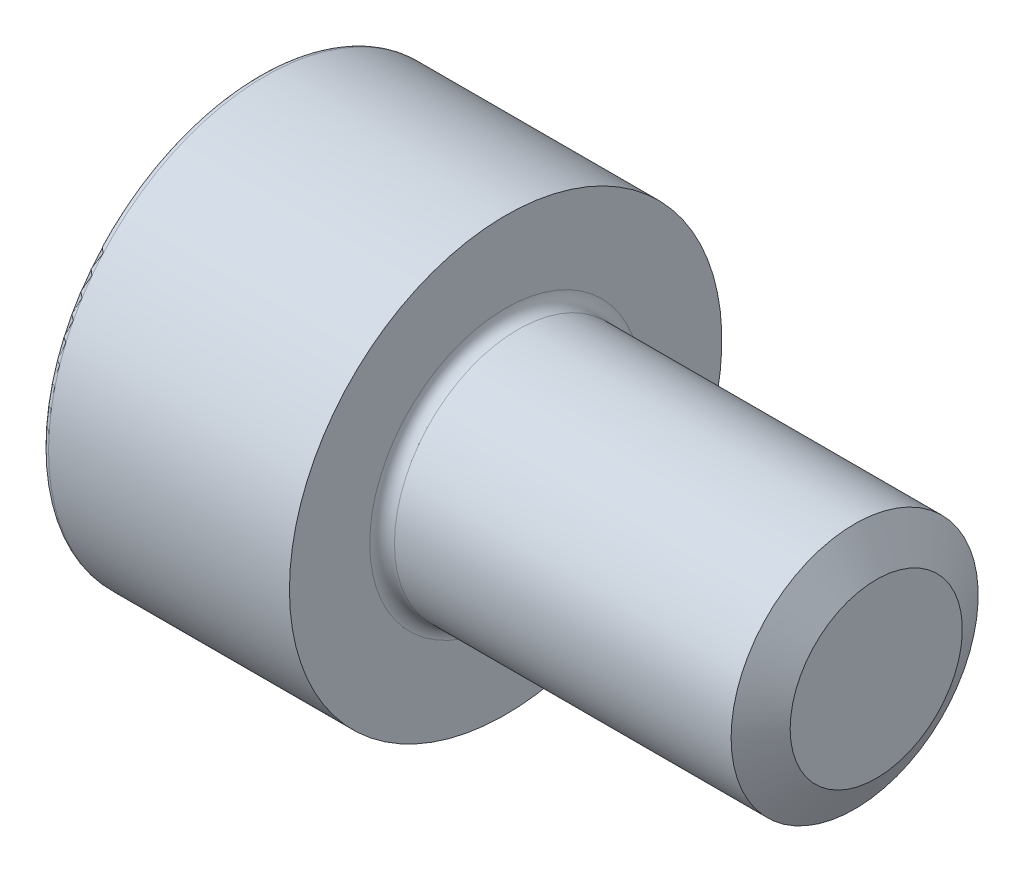
ISO-10303-21;
HEADER;
FILE_DESCRIPTION(('STEP AP214'),'2;1');
FILE_NAME('part.step','',(''),(''),'','','');
FILE_SCHEMA(('AUTOMOTIVE_DESIGN { 1 0 10303 214 1 1 1 1 }'));
ENDSEC;
DATA;
#1=APPLICATION_CONTEXT('core data for automotive mechanical design processes');
#2=APPLICATION_PROTOCOL_DEFINITION('international standard','automotive_design',2000,#1);
#3=PRODUCT_CONTEXT('',#1,'mechanical');
#4=PRODUCT('Part','Part','',(#3));
#5=PRODUCT_RELATED_PRODUCT_CATEGORY('part','',(#4));
#6=PRODUCT_DEFINITION_FORMATION('','',#4);
#7=PRODUCT_DEFINITION_CONTEXT('part definition',#1,'design');
#8=PRODUCT_DEFINITION('design','',#6,#7);
#9=PRODUCT_DEFINITION_SHAPE('','',#8);
#10=(LENGTH_UNIT() NAMED_UNIT(*) SI_UNIT(.MILLI.,.METRE.));
#11=(NAMED_UNIT(*) PLANE_ANGLE_UNIT() SI_UNIT($,.RADIAN.));
#12=(NAMED_UNIT(*) SI_UNIT($,.STERADIAN.) SOLID_ANGLE_UNIT());
#13=UNCERTAINTY_MEASURE_WITH_UNIT(LENGTH_MEASURE(1.E-05),#10,'distance_accuracy_value','');
#14=(GEOMETRIC_REPRESENTATION_CONTEXT(3) GLOBAL_UNCERTAINTY_ASSIGNED_CONTEXT((#13)) GLOBAL_UNIT_ASSIGNED_CONTEXT((#10,
#11,#12)) REPRESENTATION_CONTEXT('',''));
#15=CARTESIAN_POINT('',(0.,0.,0.));
#16=DIRECTION('',(0.,0.,1.));
#17=DIRECTION('',(1.,0.,0.));
#18=AXIS2_PLACEMENT_3D('',#15,#16,#17);
#19=CARTESIAN_POINT('',(0.,0.,0.));
#20=DIRECTION('',(-1.,0.,0.));
#21=DIRECTION('',(0.,0.,1.));
#22=AXIS2_PLACEMENT_3D('',#19,#20,#21);
#23=CYLINDRICAL_SURFACE('',#22,2.);
#24=CARTESIAN_POINT('',(4.2,0.,0.));
#25=DIRECTION('',(-1.,0.,0.));
#26=DIRECTION('',(0.,0.,1.));
#27=AXIS2_PLACEMENT_3D('',#24,#25,#26);
#28=CIRCLE('',#27,2.);
#29=CARTESIAN_POINT('',(4.2,0.,2.));
#30=VERTEX_POINT('',#29);
#31=EDGE_CURVE('E140',#30,#30,#28,.T.);
#32=ORIENTED_EDGE('',*,*,#31,.F.);
#33=EDGE_LOOP('',(#32));
#34=FACE_BOUND('',#33,.T.);
#35=CARTESIAN_POINT('',(9.65001026681725,0.,0.));
#36=DIRECTION('',(-1.,0.,0.));
#37=DIRECTION('',(0.,0.,1.));
#38=AXIS2_PLACEMENT_3D('',#35,#36,#37);
#39=CIRCLE('',#38,2.);
#40=CARTESIAN_POINT('',(9.65001026681725,0.,2.));
#41=VERTEX_POINT('',#40);
#42=EDGE_CURVE('E310',#41,#41,#39,.T.);
#43=ORIENTED_EDGE('',*,*,#42,.T.);
#44=EDGE_LOOP('',(#43));
#45=FACE_BOUND('',#44,.T.);
#46=ADVANCED_FACE('F37',(#34,#45),#23,.T.);
#47=CARTESIAN_POINT('',(0.,0.,0.));
#48=DIRECTION('',(1.,0.,0.));
#49=DIRECTION('',(0.,0.,-1.));
#50=AXIS2_PLACEMENT_3D('',#47,#48,#49);
#51=PLANE('',#50);
#52=CARTESIAN_POINT('',(0.,0.,0.));
#53=DIRECTION('',(1.,0.,0.));
#54=DIRECTION('',(0.,0.,-1.));
#55=AXIS2_PLACEMENT_3D('',#52,#53,#54);
#56=CIRCLE('',#55,3.4);
#57=CARTESIAN_POINT('',(0.,0.,-3.4));
#58=VERTEX_POINT('',#57);
#59=EDGE_CURVE('E45',#58,#58,#56,.F.);
#60=ORIENTED_EDGE('',*,*,#59,.T.);
#61=EDGE_LOOP('',(#60));
#62=FACE_BOUND('',#61,.T.);
#63=DIRECTION('',(0.,0.866025403784438,-0.5));
#64=VECTOR('',#63,1.);
#65=CARTESIAN_POINT('',(0.,0.,1.72));
#66=LINE('',#65,#64);
#67=CARTESIAN_POINT('',(0.,0.,1.72));
#68=VERTEX_POINT('',#67);
#69=CARTESIAN_POINT('',(0.,1.48956369450923,0.859999999999999));
#70=VERTEX_POINT('',#69);
#71=EDGE_CURVE('E126',#68,#70,#66,.T.);
#72=ORIENTED_EDGE('',*,*,#71,.F.);
#73=DIRECTION('',(0.,0.866025403784439,0.5));
#74=VECTOR('',#73,1.);
#75=CARTESIAN_POINT('',(0.,-1.48956369450923,0.86));
#76=LINE('',#75,#74);
#77=CARTESIAN_POINT('',(0.,-1.48956369450923,0.86));
#78=VERTEX_POINT('',#77);
#79=EDGE_CURVE('E52',#78,#68,#76,.T.);
#80=ORIENTED_EDGE('',*,*,#79,.F.);
#81=DIRECTION('',(0.,0.,1.));
#82=VECTOR('',#81,1.);
#83=CARTESIAN_POINT('',(0.,-1.48956369450923,-0.86));
#84=LINE('',#83,#82);
#85=CARTESIAN_POINT('',(0.,-1.48956369450923,-0.86));
#86=VERTEX_POINT('',#85);
#87=EDGE_CURVE('E136',#86,#78,#84,.T.);
#88=ORIENTED_EDGE('',*,*,#87,.F.);
#89=DIRECTION('',(0.,-0.866025403784438,0.5));
#90=VECTOR('',#89,1.);
#91=CARTESIAN_POINT('',(0.,0.,-1.72));
#92=LINE('',#91,#90);
#93=CARTESIAN_POINT('',(0.,0.,-1.72));
#94=VERTEX_POINT('',#93);
#95=EDGE_CURVE('E134',#94,#86,#92,.T.);
#96=ORIENTED_EDGE('',*,*,#95,.F.);
#97=DIRECTION('',(0.,-0.866025403784439,-0.5));
#98=VECTOR('',#97,1.);
#99=CARTESIAN_POINT('',(0.,1.48956369450923,-0.86));
#100=LINE('',#99,#98);
#101=CARTESIAN_POINT('',(0.,1.48956369450923,-0.86));
#102=VERTEX_POINT('',#101);
#103=EDGE_CURVE('E100',#102,#94,#100,.T.);
#104=ORIENTED_EDGE('',*,*,#103,.F.);
#105=DIRECTION('',(0.,0.,-1.));
#106=VECTOR('',#105,1.);
#107=CARTESIAN_POINT('',(0.,1.48956369450923,0.859999999999999));
#108=LINE('',#107,#106);
#109=EDGE_CURVE('E130',#70,#102,#108,.T.);
#110=ORIENTED_EDGE('',*,*,#109,.F.);
#111=EDGE_LOOP('',(#72,#80,#88,#96,#104,#110));
#112=FACE_BOUND('',#111,.T.);
#113=ADVANCED_FACE('F156',(#62,#112),#51,.F.);
#114=CARTESIAN_POINT('',(0.,0.,0.));
#115=DIRECTION('',(-1.,0.,0.));
#116=DIRECTION('',(0.,0.,1.));
#117=AXIS2_PLACEMENT_3D('',#114,#115,#116);
#118=CYLINDRICAL_SURFACE('',#117,3.5);
#119=CARTESIAN_POINT('',(0.1,0.,0.));
#120=DIRECTION('',(1.,0.,0.));
#121=DIRECTION('',(0.,0.,-1.));
#122=AXIS2_PLACEMENT_3D('',#119,#120,#121);
#123=CIRCLE('',#122,3.5);
#124=CARTESIAN_POINT('',(0.1,0.,-3.5));
#125=VERTEX_POINT('',#124);
#126=EDGE_CURVE('E11',#125,#125,#123,.T.);
#127=ORIENTED_EDGE('',*,*,#126,.T.);
#128=EDGE_LOOP('',(#127));
#129=FACE_BOUND('',#128,.T.);
#130=CARTESIAN_POINT('',(4.,0.,0.));
#131=DIRECTION('',(-1.,0.,0.));
#132=DIRECTION('',(0.,0.,1.));
#133=AXIS2_PLACEMENT_3D('',#130,#131,#132);
#134=CIRCLE('',#133,3.5);
#135=CARTESIAN_POINT('',(4.,0.,3.5));
#136=VERTEX_POINT('',#135);
#137=EDGE_CURVE('E151',#136,#136,#134,.T.);
#138=ORIENTED_EDGE('',*,*,#137,.T.);
#139=EDGE_LOOP('',(#138));
#140=FACE_BOUND('',#139,.T.);
#141=ADVANCED_FACE('F175',(#129,#140),#118,.T.);
#142=CARTESIAN_POINT('',(4.,3.5,0.));
#143=DIRECTION('',(-1.,0.,0.));
#144=DIRECTION('',(0.,0.,1.));
#145=AXIS2_PLACEMENT_3D('',#142,#143,#144);
#146=PLANE('',#145);
#147=ORIENTED_EDGE('',*,*,#137,.F.);
#148=EDGE_LOOP('',(#147));
#149=FACE_BOUND('',#148,.T.);
#150=CARTESIAN_POINT('',(4.,0.,0.));
#151=DIRECTION('',(-1.,0.,0.));
#152=DIRECTION('',(0.,0.,1.));
#153=AXIS2_PLACEMENT_3D('',#150,#151,#152);
#154=CIRCLE('',#153,2.2);
#155=CARTESIAN_POINT('',(4.,0.,2.2));
#156=VERTEX_POINT('',#155);
#157=EDGE_CURVE('E148',#156,#156,#154,.T.);
#158=ORIENTED_EDGE('',*,*,#157,.T.);
#159=EDGE_LOOP('',(#158));
#160=FACE_BOUND('',#159,.T.);
#161=ADVANCED_FACE('F184',(#149,#160),#146,.F.);
#162=CARTESIAN_POINT('',(4.2,0.,0.));
#163=DIRECTION('',(-1.,0.,0.));
#164=DIRECTION('',(0.,0.,1.));
#165=AXIS2_PLACEMENT_3D('',#162,#163,#164);
#166=TOROIDAL_SURFACE('',#165,2.2,0.2);
#167=ORIENTED_EDGE('',*,*,#157,.F.);
#168=EDGE_LOOP('',(#167));
#169=FACE_BOUND('',#168,.T.);
#170=ORIENTED_EDGE('',*,*,#31,.T.);
#171=EDGE_LOOP('',(#170));
#172=FACE_BOUND('',#171,.T.);
#173=ADVANCED_FACE('F180',(#169,#172),#166,.F.);
#174=CARTESIAN_POINT('',(2.,-1.48956369450923,0.86));
#175=DIRECTION('',(0.,-0.5,0.866025403784439));
#176=DIRECTION('',(0.,-0.866025403784439,-0.5));
#177=AXIS2_PLACEMENT_3D('',#174,#175,#176);
#178=PLANE('',#177);
#179=ORIENTED_EDGE('',*,*,#79,.T.);
#180=DIRECTION('',(-1.,0.,0.));
#181=VECTOR('',#180,1.);
#182=CARTESIAN_POINT('',(2.,0.,1.72));
#183=LINE('',#182,#181);
#184=CARTESIAN_POINT('',(2.,0.,1.72));
#185=VERTEX_POINT('',#184);
#186=EDGE_CURVE('E82',#185,#68,#183,.T.);
#187=ORIENTED_EDGE('',*,*,#186,.F.);
#188=DIRECTION('',(0.,0.866025403784439,0.5));
#189=VECTOR('',#188,1.);
#190=CARTESIAN_POINT('',(2.,-1.48956369450923,0.86));
#191=LINE('',#190,#189);
#192=CARTESIAN_POINT('',(2.,-1.48956369450923,0.86));
#193=VERTEX_POINT('',#192);
#194=EDGE_CURVE('E138',#193,#185,#191,.T.);
#195=ORIENTED_EDGE('',*,*,#194,.F.);
#196=DIRECTION('',(-1.,0.,0.));
#197=VECTOR('',#196,1.);
#198=CARTESIAN_POINT('',(2.,-1.48956369450923,0.86));
#199=LINE('',#198,#197);
#200=EDGE_CURVE('E60',#193,#78,#199,.T.);
#201=ORIENTED_EDGE('',*,*,#200,.T.);
#202=EDGE_LOOP('',(#179,#187,#195,#201));
#203=FACE_BOUND('',#202,.T.);
#204=ADVANCED_FACE('F183',(#203),#178,.F.);
#205=CARTESIAN_POINT('',(2.,-1.48956369450923,-0.86));
#206=DIRECTION('',(0.,-1.,0.));
#207=DIRECTION('',(0.,0.,-1.));
#208=AXIS2_PLACEMENT_3D('',#205,#206,#207);
#209=PLANE('',#208);
#210=ORIENTED_EDGE('',*,*,#87,.T.);
#211=ORIENTED_EDGE('',*,*,#200,.F.);
#212=DIRECTION('',(0.,0.,1.));
#213=VECTOR('',#212,1.);
#214=CARTESIAN_POINT('',(2.,-1.48956369450923,-0.86));
#215=LINE('',#214,#213);
#216=CARTESIAN_POINT('',(2.,-1.48956369450923,-0.86));
#217=VERTEX_POINT('',#216);
#218=EDGE_CURVE('E112',#217,#193,#215,.T.);
#219=ORIENTED_EDGE('',*,*,#218,.F.);
#220=DIRECTION('',(-1.,0.,0.));
#221=VECTOR('',#220,1.);
#222=CARTESIAN_POINT('',(2.,-1.48956369450923,-0.86));
#223=LINE('',#222,#221);
#224=EDGE_CURVE('E104',#217,#86,#223,.T.);
#225=ORIENTED_EDGE('',*,*,#224,.T.);
#226=EDGE_LOOP('',(#210,#211,#219,#225));
#227=FACE_BOUND('',#226,.T.);
#228=ADVANCED_FACE('F214',(#227),#209,.F.);
#229=CARTESIAN_POINT('',(2.,0.,-1.72));
#230=DIRECTION('',(0.,-0.5,-0.866025403784439));
#231=DIRECTION('',(0.,0.866025403784438,-0.5));
#232=AXIS2_PLACEMENT_3D('',#229,#230,#231);
#233=PLANE('',#232);
#234=ORIENTED_EDGE('',*,*,#95,.T.);
#235=ORIENTED_EDGE('',*,*,#224,.F.);
#236=DIRECTION('',(0.,-0.866025403784438,0.5));
#237=VECTOR('',#236,1.);
#238=CARTESIAN_POINT('',(2.,0.,-1.72));
#239=LINE('',#238,#237);
#240=CARTESIAN_POINT('',(2.,0.,-1.72));
#241=VERTEX_POINT('',#240);
#242=EDGE_CURVE('E108',#241,#217,#239,.T.);
#243=ORIENTED_EDGE('',*,*,#242,.F.);
#244=DIRECTION('',(-1.,0.,0.));
#245=VECTOR('',#244,1.);
#246=CARTESIAN_POINT('',(2.,0.,-1.72));
#247=LINE('',#246,#245);
#248=EDGE_CURVE('E93',#241,#94,#247,.T.);
#249=ORIENTED_EDGE('',*,*,#248,.T.);
#250=EDGE_LOOP('',(#234,#235,#243,#249));
#251=FACE_BOUND('',#250,.T.);
#252=ADVANCED_FACE('F109',(#251),#233,.F.);
#253=CARTESIAN_POINT('',(2.,1.48956369450923,-0.86));
#254=DIRECTION('',(0.,0.5,-0.866025403784439));
#255=DIRECTION('',(0.,0.866025403784439,0.5));
#256=AXIS2_PLACEMENT_3D('',#253,#254,#255);
#257=PLANE('',#256);
#258=ORIENTED_EDGE('',*,*,#103,.T.);
#259=ORIENTED_EDGE('',*,*,#248,.F.);
#260=DIRECTION('',(0.,-0.866025403784439,-0.5));
#261=VECTOR('',#260,1.);
#262=CARTESIAN_POINT('',(2.,1.48956369450923,-0.86));
#263=LINE('',#262,#261);
#264=CARTESIAN_POINT('',(2.,1.48956369450923,-0.86));
#265=VERTEX_POINT('',#264);
#266=EDGE_CURVE('E97',#265,#241,#263,.T.);
#267=ORIENTED_EDGE('',*,*,#266,.F.);
#268=DIRECTION('',(-1.,0.,0.));
#269=VECTOR('',#268,1.);
#270=CARTESIAN_POINT('',(2.,1.48956369450923,-0.86));
#271=LINE('',#270,#269);
#272=EDGE_CURVE('E105',#265,#102,#271,.T.);
#273=ORIENTED_EDGE('',*,*,#272,.T.);
#274=EDGE_LOOP('',(#258,#259,#267,#273));
#275=FACE_BOUND('',#274,.T.);
#276=ADVANCED_FACE('F95',(#275),#257,.F.);
#277=CARTESIAN_POINT('',(2.,1.48956369450923,0.859999999999999));
#278=DIRECTION('',(0.,1.,0.));
#279=DIRECTION('',(0.,0.,1.));
#280=AXIS2_PLACEMENT_3D('',#277,#278,#279);
#281=PLANE('',#280);
#282=ORIENTED_EDGE('',*,*,#109,.T.);
#283=ORIENTED_EDGE('',*,*,#272,.F.);
#284=DIRECTION('',(0.,0.,-1.));
#285=VECTOR('',#284,1.);
#286=CARTESIAN_POINT('',(2.,1.48956369450923,0.859999999999999));
#287=LINE('',#286,#285);
#288=CARTESIAN_POINT('',(2.,1.48956369450923,0.859999999999999));
#289=VERTEX_POINT('',#288);
#290=EDGE_CURVE('E118',#289,#265,#287,.T.);
#291=ORIENTED_EDGE('',*,*,#290,.F.);
#292=DIRECTION('',(-1.,0.,0.));
#293=VECTOR('',#292,1.);
#294=CARTESIAN_POINT('',(2.,1.48956369450923,0.859999999999999));
#295=LINE('',#294,#293);
#296=EDGE_CURVE('E143',#289,#70,#295,.T.);
#297=ORIENTED_EDGE('',*,*,#296,.T.);
#298=EDGE_LOOP('',(#282,#283,#291,#297));
#299=FACE_BOUND('',#298,.T.);
#300=ADVANCED_FACE('F232',(#299),#281,.F.);
#301=CARTESIAN_POINT('',(2.,0.,1.72));
#302=DIRECTION('',(0.,0.5,0.866025403784439));
#303=DIRECTION('',(0.,-0.866025403784438,0.5));
#304=AXIS2_PLACEMENT_3D('',#301,#302,#303);
#305=PLANE('',#304);
#306=ORIENTED_EDGE('',*,*,#71,.T.);
#307=ORIENTED_EDGE('',*,*,#296,.F.);
#308=DIRECTION('',(0.,0.866025403784438,-0.5));
#309=VECTOR('',#308,1.);
#310=CARTESIAN_POINT('',(2.,0.,1.72));
#311=LINE('',#310,#309);
#312=EDGE_CURVE('E120',#185,#289,#311,.T.);
#313=ORIENTED_EDGE('',*,*,#312,.F.);
#314=ORIENTED_EDGE('',*,*,#186,.T.);
#315=EDGE_LOOP('',(#306,#307,#313,#314));
#316=FACE_BOUND('',#315,.T.);
#317=ADVANCED_FACE('F239',(#316),#305,.F.);
#318=CARTESIAN_POINT('',(2.,1.48956369450923,2.58));
#319=DIRECTION('',(-1.,0.,0.));
#320=DIRECTION('',(0.,0.,1.));
#321=AXIS2_PLACEMENT_3D('',#318,#319,#320);
#322=PLANE('',#321);
#323=ORIENTED_EDGE('',*,*,#194,.T.);
#324=ORIENTED_EDGE('',*,*,#312,.T.);
#325=ORIENTED_EDGE('',*,*,#290,.T.);
#326=ORIENTED_EDGE('',*,*,#266,.T.);
#327=ORIENTED_EDGE('',*,*,#242,.T.);
#328=ORIENTED_EDGE('',*,*,#218,.T.);
#329=EDGE_LOOP('',(#323,#324,#325,#326,#327,#328));
#330=FACE_BOUND('',#329,.T.);
#331=ADVANCED_FACE('F115',(#330),#322,.T.);
#332=CARTESIAN_POINT('',(9.65001026681725,0.,0.));
#333=DIRECTION('',(-1.,0.,0.));
#334=DIRECTION('',(0.,0.,1.));
#335=AXIS2_PLACEMENT_3D('',#332,#333,#334);
#336=CONICAL_SURFACE('',#335,2.,1.04719755119659);
#337=CARTESIAN_POINT('',(10.,0.,0.));
#338=DIRECTION('',(-1.,0.,0.));
#339=DIRECTION('',(0.,0.,1.));
#340=AXIS2_PLACEMENT_3D('',#337,#338,#339);
#341=CIRCLE('',#340,1.3938);
#342=CARTESIAN_POINT('',(10.,0.,1.3938));
#343=VERTEX_POINT('',#342);
#344=EDGE_CURVE('E127',#343,#343,#341,.T.);
#345=ORIENTED_EDGE('',*,*,#344,.T.);
#346=EDGE_LOOP('',(#345));
#347=FACE_BOUND('',#346,.T.);
#348=ORIENTED_EDGE('',*,*,#42,.F.);
#349=EDGE_LOOP('',(#348));
#350=FACE_BOUND('',#349,.T.);
#351=ADVANCED_FACE('F165',(#347,#350),#336,.T.);
#352=CARTESIAN_POINT('',(10.,2.,0.));
#353=DIRECTION('',(-1.,0.,0.));
#354=DIRECTION('',(0.,0.,1.));
#355=AXIS2_PLACEMENT_3D('',#352,#353,#354);
#356=PLANE('',#355);
#357=ORIENTED_EDGE('',*,*,#344,.F.);
#358=EDGE_LOOP('',(#357));
#359=FACE_BOUND('',#358,.T.);
#360=ADVANCED_FACE('F160',(#359),#356,.F.);
#361=CARTESIAN_POINT('',(0.1,0.,0.));
#362=DIRECTION('',(1.,0.,0.));
#363=DIRECTION('',(0.,0.,-1.));
#364=AXIS2_PLACEMENT_3D('',#361,#362,#363);
#365=TOROIDAL_SURFACE('',#364,3.4,0.1);
#366=ORIENTED_EDGE('',*,*,#126,.F.);
#367=EDGE_LOOP('',(#366));
#368=FACE_BOUND('',#367,.T.);
#369=ORIENTED_EDGE('',*,*,#59,.F.);
#370=EDGE_LOOP('',(#369));
#371=FACE_BOUND('',#370,.T.);
#372=ADVANCED_FACE('F39',(#368,#371),#365,.T.);
#373=CLOSED_SHELL('',(#46,#113,#141,#161,#173,#204,#228,#252,#276,#300,#317,#331,#351,#360,#372));
#374=MANIFOLD_SOLID_BREP('B2',#373);
#375=ADVANCED_BREP_SHAPE_REPRESENTATION('',(#18,#374),#14);
#376=SHAPE_DEFINITION_REPRESENTATION(#9,#375);
ENDSEC;
END-ISO-10303-21;
